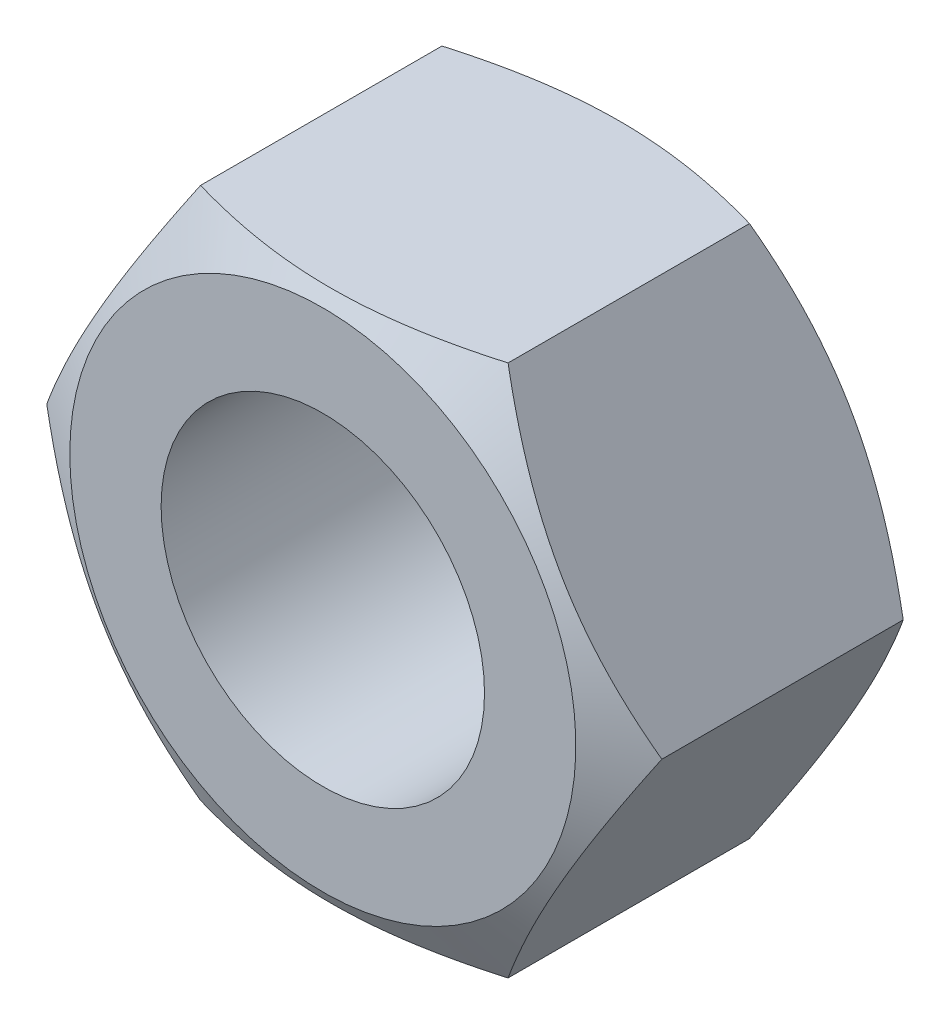
ISO-10303-21;
HEADER;
FILE_DESCRIPTION(('STEP AP214'),'2;1');
FILE_NAME('part.step','',(''),(''),'','','');
FILE_SCHEMA(('AUTOMOTIVE_DESIGN { 1 0 10303 214 1 1 1 1 }'));
ENDSEC;
DATA;
#1=APPLICATION_CONTEXT('core data for automotive mechanical design processes');
#2=APPLICATION_PROTOCOL_DEFINITION('international standard','automotive_design',2000,#1);
#3=PRODUCT_CONTEXT('',#1,'mechanical');
#4=PRODUCT('Part','Part','',(#3));
#5=PRODUCT_RELATED_PRODUCT_CATEGORY('part','',(#4));
#6=PRODUCT_DEFINITION_FORMATION('','',#4);
#7=PRODUCT_DEFINITION_CONTEXT('part definition',#1,'design');
#8=PRODUCT_DEFINITION('design','',#6,#7);
#9=PRODUCT_DEFINITION_SHAPE('','',#8);
#10=(LENGTH_UNIT() NAMED_UNIT(*) SI_UNIT(.MILLI.,.METRE.));
#11=(NAMED_UNIT(*) PLANE_ANGLE_UNIT() SI_UNIT($,.RADIAN.));
#12=(NAMED_UNIT(*) SI_UNIT($,.STERADIAN.) SOLID_ANGLE_UNIT());
#13=UNCERTAINTY_MEASURE_WITH_UNIT(LENGTH_MEASURE(1.E-05),#10,'distance_accuracy_value','');
#14=(GEOMETRIC_REPRESENTATION_CONTEXT(3) GLOBAL_UNCERTAINTY_ASSIGNED_CONTEXT((#13)) GLOBAL_UNIT_ASSIGNED_CONTEXT((#10,
#11,#12)) REPRESENTATION_CONTEXT('',''));
#15=CARTESIAN_POINT('',(0.,0.,0.));
#16=DIRECTION('',(0.,0.,1.));
#17=DIRECTION('',(1.,0.,0.));
#18=AXIS2_PLACEMENT_3D('',#15,#16,#17);
#19=CARTESIAN_POINT('',(8.08290376865476,0.,-8.));
#20=DIRECTION('',(0.866025403784439,0.5,0.));
#21=DIRECTION('',(-0.5,0.866025403784439,0.));
#22=AXIS2_PLACEMENT_3D('',#19,#20,#21);
#23=PLANE('',#22);
#24=CARTESIAN_POINT('',(8.0830192387086,-0.000199999999995565,-0.827354044650867));
#25=CARTESIAN_POINT('',(7.99418356332251,0.153667903293396,-0.776072441269853));
#26=CARTESIAN_POINT('',(7.90501666556988,0.308109500554255,-0.727118188219954));
#27=CARTESIAN_POINT('',(7.72595873929905,0.618246926353258,-0.634505381486502));
#28=CARTESIAN_POINT('',(7.63606741609895,0.773943265295419,-0.590849112295729));
#29=CARTESIAN_POINT('',(7.36495417725225,1.24352516958247,-0.468684186395862));
#30=CARTESIAN_POINT('',(7.18266208641081,1.5592643327378,-0.399198151111319));
#31=CARTESIAN_POINT('',(6.9098652897096,2.03176224476633,-0.317717550615464));
#32=CARTESIAN_POINT('',(6.82017566928259,2.18710922425749,-0.29450607909784));
#33=CARTESIAN_POINT('',(6.64039116946081,2.49850511236217,-0.255583808648828));
#34=CARTESIAN_POINT('',(6.55029632658303,2.65455395772641,-0.239872346995896));
#35=CARTESIAN_POINT('',(6.36995016641051,2.96692267009518,-0.216350507499427));
#36=CARTESIAN_POINT('',(6.27969914366236,3.12324202693001,-0.208531162879232));
#37=CARTESIAN_POINT('',(6.09911871281641,3.43601650800788,-0.200952835988675));
#38=CARTESIAN_POINT('',(6.00878930722636,3.59247162790734,-0.201193604710355));
#39=CARTESIAN_POINT('',(5.76131663355911,4.02110687218394,-0.212932326031969));
#40=CARTESIAN_POINT('',(5.60425437562033,4.2931466828854,-0.232638336959285));
#41=CARTESIAN_POINT('',(5.29117305327855,4.8354194400822,-0.295126054342138));
#42=CARTESIAN_POINT('',(5.13515508991674,5.10565047951828,-0.337929118329354));
#43=CARTESIAN_POINT('',(4.82144370220968,5.64901454193984,-0.44492427392673));
#44=CARTESIAN_POINT('',(4.66378986193159,5.92207900330984,-0.509569688786037));
#45=CARTESIAN_POINT('',(4.35083323311213,6.46413578499063,-0.656288666063407));
#46=CARTESIAN_POINT('',(4.19552643669177,6.73313504715144,-0.738327765241932));
#47=CARTESIAN_POINT('',(4.04133641427354,7.0002,-0.827354044650869));
#48=B_SPLINE_CURVE_WITH_KNOTS('',3,(#24,#25,#26,#27,#28,#29,#30,#31,#32,#33,#34,#35,#36,#37,#38,
#39,#40,#41,#42,#43,#44,#45,#46,#47),.UNSPECIFIED.,.F.,.F.,(4,2,2,2,2,2,2,2,2,2,2,4),(0.,
0.554727910214695,1.10969417576209,2.2219327402719,2.76443041023617,3.30688013473357,
3.8487128486711,4.39052882332379,5.33376515141418,6.27787517570456,7.2429241888324,
8.20607866430097),.UNSPECIFIED.);
#49=CARTESIAN_POINT('',(8.08290376865476,0.,-0.827287376555649));
#50=VERTEX_POINT('',#49);
#51=CARTESIAN_POINT('',(4.04145188432738,7.,-0.827287376555651));
#52=VERTEX_POINT('',#51);
#53=EDGE_CURVE('E55',#50,#52,#48,.T.);
#54=ORIENTED_EDGE('',*,*,#53,.F.);
#55=DIRECTION('',(0.,0.,1.));
#56=VECTOR('',#55,1.);
#57=CARTESIAN_POINT('',(8.08290376865476,0.,-8.));
#58=LINE('',#57,#56);
#59=CARTESIAN_POINT('',(8.08290376865476,0.,-7.17271262344435));
#60=VERTEX_POINT('',#59);
#61=EDGE_CURVE('E12',#60,#50,#58,.T.);
#62=ORIENTED_EDGE('',*,*,#61,.F.);
#63=CARTESIAN_POINT('',(8.0830192387086,-0.000199999999995565,-7.17264595534913));
#64=CARTESIAN_POINT('',(7.99418356332251,0.153667903293396,-7.22392755873015));
#65=CARTESIAN_POINT('',(7.90501666556988,0.308109500554254,-7.27288181178005));
#66=CARTESIAN_POINT('',(7.72595873929905,0.618246926353259,-7.3654946185135));
#67=CARTESIAN_POINT('',(7.63606741609895,0.77394326529542,-7.40915088770427));
#68=CARTESIAN_POINT('',(7.36495417725225,1.24352516958247,-7.53131581360414));
#69=CARTESIAN_POINT('',(7.18266208641081,1.55926433273781,-7.60080184888868));
#70=CARTESIAN_POINT('',(6.9098652897096,2.03176224476633,-7.68228244938454));
#71=CARTESIAN_POINT('',(6.82017566928259,2.18710922425749,-7.70549392090216));
#72=CARTESIAN_POINT('',(6.64039116946081,2.49850511236217,-7.74441619135117));
#73=CARTESIAN_POINT('',(6.55029632658303,2.65455395772641,-7.7601276530041));
#74=CARTESIAN_POINT('',(6.36995016641051,2.96692267009518,-7.78364949250057));
#75=CARTESIAN_POINT('',(6.27969914366237,3.12324202693001,-7.79146883712077));
#76=CARTESIAN_POINT('',(6.09911871281641,3.43601650800788,-7.79904716401133));
#77=CARTESIAN_POINT('',(6.00878930722637,3.59247162790734,-7.79880639528965));
#78=CARTESIAN_POINT('',(5.76131663355911,4.02110687218394,-7.78706767396803));
#79=CARTESIAN_POINT('',(5.60425437562033,4.2931466828854,-7.76736166304071));
#80=CARTESIAN_POINT('',(5.29117305327855,4.8354194400822,-7.70487394565786));
#81=CARTESIAN_POINT('',(5.13515508991674,5.10565047951828,-7.66207088167065));
#82=CARTESIAN_POINT('',(4.82144370220968,5.64901454193984,-7.55507572607327));
#83=CARTESIAN_POINT('',(4.66378986193159,5.92207900330984,-7.49043031121396));
#84=CARTESIAN_POINT('',(4.35083323311213,6.46413578499063,-7.34371133393659));
#85=CARTESIAN_POINT('',(4.19552643669177,6.73313504715144,-7.26167223475807));
#86=CARTESIAN_POINT('',(4.04133641427354,7.0002,-7.17264595534913));
#87=B_SPLINE_CURVE_WITH_KNOTS('',3,(#63,#64,#65,#66,#67,#68,#69,#70,#71,#72,#73,#74,#75,#76,#77,
#78,#79,#80,#81,#82,#83,#84,#85,#86),.UNSPECIFIED.,.F.,.F.,(4,2,2,2,2,2,2,2,2,2,2,4),(0.,
0.554727910214694,1.10969417576209,2.2219327402719,2.76443041023617,3.30688013473357,
3.8487128486711,4.39052882332379,5.33376515141418,6.27787517570456,7.2429241888324,
8.20607866430097),.UNSPECIFIED.);
#88=CARTESIAN_POINT('',(4.04145188432738,7.,-7.17271262344435));
#89=VERTEX_POINT('',#88);
#90=EDGE_CURVE('E124',#60,#89,#87,.T.);
#91=ORIENTED_EDGE('',*,*,#90,.T.);
#92=DIRECTION('',(0.,0.,1.));
#93=VECTOR('',#92,1.);
#94=CARTESIAN_POINT('',(4.04145188432738,7.,-8.));
#95=LINE('',#94,#93);
#96=EDGE_CURVE('E42',#89,#52,#95,.T.);
#97=ORIENTED_EDGE('',*,*,#96,.T.);
#98=EDGE_LOOP('',(#54,#62,#91,#97));
#99=FACE_BOUND('',#98,.T.);
#100=ADVANCED_FACE('F38',(#99),#23,.T.);
#101=CARTESIAN_POINT('',(4.04145188432738,-7.,-8.));
#102=DIRECTION('',(0.866025403784439,-0.5,0.));
#103=DIRECTION('',(0.5,0.866025403784439,0.));
#104=AXIS2_PLACEMENT_3D('',#101,#102,#103);
#105=PLANE('',#104);
#106=CARTESIAN_POINT('',(4.04133641427354,-7.0002,-0.827354044650866));
#107=CARTESIAN_POINT('',(4.13017208965962,-6.8463320967066,-0.776072441269853));
#108=CARTESIAN_POINT('',(4.21933898741226,-6.69189049944575,-0.727118188219953));
#109=CARTESIAN_POINT('',(4.39839691368309,-6.38175307364674,-0.634505381486501));
#110=CARTESIAN_POINT('',(4.48828823688318,-6.22605673470458,-0.590849112295728));
#111=CARTESIAN_POINT('',(4.75940147572989,-5.75647483041753,-0.46868418639586));
#112=CARTESIAN_POINT('',(4.94169356657133,-5.4407356672622,-0.399198151111317));
#113=CARTESIAN_POINT('',(5.21449036327254,-4.96823775523367,-0.317717550615462));
#114=CARTESIAN_POINT('',(5.30417998369955,-4.81289077574251,-0.294506079097839));
#115=CARTESIAN_POINT('',(5.48396448352133,-4.50149488763783,-0.255583808648826));
#116=CARTESIAN_POINT('',(5.57405932639911,-4.34544604227359,-0.239872346995894));
#117=CARTESIAN_POINT('',(5.75440548657163,-4.03307732990482,-0.216350507499425));
#118=CARTESIAN_POINT('',(5.84465650931977,-3.87675797306999,-0.20853116287923));
#119=CARTESIAN_POINT('',(6.02523694016572,-3.56398349199212,-0.200952835988673));
#120=CARTESIAN_POINT('',(6.11556634575577,-3.40752837209266,-0.201193604710352));
#121=CARTESIAN_POINT('',(6.36303901942303,-2.97889312781606,-0.212932326031967));
#122=CARTESIAN_POINT('',(6.52010127736181,-2.7068533171146,-0.232638336959283));
#123=CARTESIAN_POINT('',(6.83318259970358,-2.1645805599178,-0.295126054342136));
#124=CARTESIAN_POINT('',(6.9892005630654,-1.89434952048172,-0.337929118329351));
#125=CARTESIAN_POINT('',(7.30291195077245,-1.35098545806016,-0.444924273926727));
#126=CARTESIAN_POINT('',(7.46056579105054,-1.07792099669016,-0.509569688786034));
#127=CARTESIAN_POINT('',(7.77352241987001,-0.535864215009367,-0.656288666063405));
#128=CARTESIAN_POINT('',(7.92882921629037,-0.266864952848556,-0.738327765241929));
#129=CARTESIAN_POINT('',(8.0830192387086,0.000200000000004987,-0.827354044650866));
#130=B_SPLINE_CURVE_WITH_KNOTS('',3,(#106,#107,#108,#109,#110,#111,#112,#113,#114,#115,#116,
#117,#118,#119,#120,#121,#122,#123,#124,#125,#126,#127,#128,#129),.UNSPECIFIED.,.F.,.F.,(4,2,2,
2,2,2,2,2,2,2,2,4),(0.,0.554727910214695,1.10969417576209,2.2219327402719,2.76443041023617,
3.30688013473357,3.8487128486711,4.39052882332379,5.33376515141418,6.27787517570456,
7.2429241888324,8.20607866430097),.UNSPECIFIED.);
#131=CARTESIAN_POINT('',(4.04145188432738,-7.,-0.827287376555648));
#132=VERTEX_POINT('',#131);
#133=EDGE_CURVE('E191',#132,#50,#130,.T.);
#134=ORIENTED_EDGE('',*,*,#133,.F.);
#135=DIRECTION('',(0.,0.,1.));
#136=VECTOR('',#135,1.);
#137=CARTESIAN_POINT('',(4.04145188432738,-7.,-8.));
#138=LINE('',#137,#136);
#139=CARTESIAN_POINT('',(4.04145188432738,-7.,-7.17271262344435));
#140=VERTEX_POINT('',#139);
#141=EDGE_CURVE('E47',#140,#132,#138,.T.);
#142=ORIENTED_EDGE('',*,*,#141,.F.);
#143=CARTESIAN_POINT('',(4.04133641427354,-7.0002,-7.17264595534913));
#144=CARTESIAN_POINT('',(4.13017208965962,-6.8463320967066,-7.22392755873015));
#145=CARTESIAN_POINT('',(4.21933898741226,-6.69189049944575,-7.27288181178005));
#146=CARTESIAN_POINT('',(4.39839691368309,-6.38175307364674,-7.3654946185135));
#147=CARTESIAN_POINT('',(4.48828823688318,-6.22605673470458,-7.40915088770427));
#148=CARTESIAN_POINT('',(4.75940147572989,-5.75647483041753,-7.53131581360414));
#149=CARTESIAN_POINT('',(4.94169356657133,-5.44073566726219,-7.60080184888868));
#150=CARTESIAN_POINT('',(5.21449036327254,-4.96823775523367,-7.68228244938454));
#151=CARTESIAN_POINT('',(5.30417998369955,-4.81289077574251,-7.70549392090216));
#152=CARTESIAN_POINT('',(5.48396448352133,-4.50149488763783,-7.74441619135117));
#153=CARTESIAN_POINT('',(5.57405932639911,-4.34544604227359,-7.76012765300411));
#154=CARTESIAN_POINT('',(5.75440548657163,-4.03307732990482,-7.78364949250058));
#155=CARTESIAN_POINT('',(5.84465650931977,-3.87675797306999,-7.79146883712077));
#156=CARTESIAN_POINT('',(6.02523694016572,-3.56398349199212,-7.79904716401133));
#157=CARTESIAN_POINT('',(6.11556634575577,-3.40752837209266,-7.79880639528965));
#158=CARTESIAN_POINT('',(6.36303901942303,-2.97889312781606,-7.78706767396803));
#159=CARTESIAN_POINT('',(6.52010127736181,-2.7068533171146,-7.76736166304072));
#160=CARTESIAN_POINT('',(6.83318259970358,-2.1645805599178,-7.70487394565786));
#161=CARTESIAN_POINT('',(6.9892005630654,-1.89434952048172,-7.66207088167065));
#162=CARTESIAN_POINT('',(7.30291195077245,-1.35098545806016,-7.55507572607327));
#163=CARTESIAN_POINT('',(7.46056579105054,-1.07792099669016,-7.49043031121397));
#164=CARTESIAN_POINT('',(7.77352241987001,-0.535864215009367,-7.3437113339366));
#165=CARTESIAN_POINT('',(7.92882921629037,-0.266864952848556,-7.26167223475807));
#166=CARTESIAN_POINT('',(8.0830192387086,0.000200000000004575,-7.17264595534913));
#167=B_SPLINE_CURVE_WITH_KNOTS('',3,(#143,#144,#145,#146,#147,#148,#149,#150,#151,#152,#153,
#154,#155,#156,#157,#158,#159,#160,#161,#162,#163,#164,#165,#166),.UNSPECIFIED.,.F.,.F.,(4,2,2,
2,2,2,2,2,2,2,2,4),(0.,0.554727910214696,1.10969417576209,2.2219327402719,2.76443041023617,
3.30688013473357,3.8487128486711,4.39052882332379,5.33376515141418,6.27787517570456,
7.2429241888324,8.20607866430097),.UNSPECIFIED.);
#168=EDGE_CURVE('E133',#140,#60,#167,.T.);
#169=ORIENTED_EDGE('',*,*,#168,.T.);
#170=ORIENTED_EDGE('',*,*,#61,.T.);
#171=EDGE_LOOP('',(#134,#142,#169,#170));
#172=FACE_BOUND('',#171,.T.);
#173=ADVANCED_FACE('F177',(#172),#105,.T.);
#174=CARTESIAN_POINT('',(4.04145188432738,-7.,-8.));
#175=DIRECTION('',(0.,1.,0.));
#176=DIRECTION('',(-1.,0.,0.));
#177=AXIS2_PLACEMENT_3D('',#174,#175,#176);
#178=PLANE('',#177);
#179=ORIENTED_EDGE('',*,*,#141,.T.);
#180=CARTESIAN_POINT('',(-10.827168769594,-6.99999999999999,-3.60435596322495));
#181=CARTESIAN_POINT('',(-10.5215663969934,-6.99999999999999,-3.45622699880289));
#182=CARTESIAN_POINT('',(-10.2152591795606,-6.99999999999999,-3.30952711799237));
#183=CARTESIAN_POINT('',(-9.60085987994179,-6.99999999999999,-3.01979023915023));
#184=CARTESIAN_POINT('',(-9.29276752264445,-6.99999999999999,-2.8767538251631));
#185=CARTESIAN_POINT('',(-8.6728227986201,-6.99999999999999,-2.59442340614397));
#186=CARTESIAN_POINT('',(-8.36095907597049,-7.,-2.45515424970264));
#187=CARTESIAN_POINT('',(-7.73473988582473,-7.,-2.18235723678039));
#188=CARTESIAN_POINT('',(-7.420384538037,-7.,-2.04882910643238));
#189=CARTESIAN_POINT('',(-6.77886645123334,-7.,-1.78499498645822));
#190=CARTESIAN_POINT('',(-6.45160910338689,-7.,-1.65491776176754));
#191=CARTESIAN_POINT('',(-5.79325666751613,-7.,-1.40467762466172));
#192=CARTESIAN_POINT('',(-5.46216115244183,-7.,-1.28451582778973));
#193=CARTESIAN_POINT('',(-4.79622957052545,-7.,-1.0572807972584));
#194=CARTESIAN_POINT('',(-4.46140270977369,-7.,-0.950180875759514));
#195=CARTESIAN_POINT('',(-3.78695986302793,-7.,-0.752522496810221));
#196=CARTESIAN_POINT('',(-3.44734542953708,-7.,-0.661958804159132));
#197=CARTESIAN_POINT('',(-2.76484412674514,-7.,-0.502194917904565));
#198=CARTESIAN_POINT('',(-2.42198324239951,-7.,-0.432886728977712));
#199=CARTESIAN_POINT('',(-1.90459403666916,-7.,-0.347906447466447));
#200=CARTESIAN_POINT('',(-1.73160237033396,-7.,-0.322742251019017));
#201=CARTESIAN_POINT('',(-1.38476896602443,-7.,-0.279235253216557));
#202=CARTESIAN_POINT('',(-1.21092731168379,-7.,-0.26089179390186));
#203=CARTESIAN_POINT('',(-0.864885948828905,-7.,-0.231620349775585));
#204=CARTESIAN_POINT('',(-0.692694134396466,-7.,-0.220599402078886));
#205=CARTESIAN_POINT('',(-0.34799890841699,-7.,-0.205846971086327));
#206=CARTESIAN_POINT('',(-0.175495502063716,-7.,-0.202115367390177));
#207=CARTESIAN_POINT('',(0.169517895134959,-7.,-0.20203055782241));
#208=CARTESIAN_POINT('',(0.342027886041942,-7.,-0.205677512641572));
#209=CARTESIAN_POINT('',(0.686741670951816,-7.,-0.220261450323908));
#210=CARTESIAN_POINT('',(0.858945449007304,-7.,-0.231198802326856));
#211=CARTESIAN_POINT('',(1.27350328635832,-7.,-0.266074172228107));
#212=CARTESIAN_POINT('',(1.51556921204422,-7.,-0.293509656195727));
#213=CARTESIAN_POINT('',(1.99787569609177,-7.,-0.361284329428631));
#214=CARTESIAN_POINT('',(2.23811600002901,-7.,-0.40162528466239));
#215=CARTESIAN_POINT('',(2.95582448196434,-7.,-0.539864265164558));
#216=CARTESIAN_POINT('',(3.43002349265797,-7.,-0.654953979013658));
#217=CARTESIAN_POINT('',(4.13939008412607,-7.,-0.854251249583947));
#218=CARTESIAN_POINT('',(4.37823837485406,-7.,-0.926107189948117));
#219=CARTESIAN_POINT('',(4.85361261218768,-7.,-1.07719793281492));
#220=CARTESIAN_POINT('',(5.0901385409162,-7.,-1.15643279206995));
#221=CARTESIAN_POINT('',(5.56094952572757,-7.,-1.32101653239824));
#222=CARTESIAN_POINT('',(5.79523527021343,-7.,-1.406363462014));
#223=CARTESIAN_POINT('',(6.26186597233566,-7.,-1.58217518441684));
#224=CARTESIAN_POINT('',(6.49421097685092,-7.,-1.67263985317144));
#225=CARTESIAN_POINT('',(7.13646100232268,-7.,-1.92953333883383));
#226=CARTESIAN_POINT('',(7.54453410007519,-7.,-2.10053819082756));
#227=CARTESIAN_POINT('',(8.35643982797106,-7.,-2.45236939905461));
#228=CARTESIAN_POINT('',(8.76027196486361,-7.,-2.63319688295132));
#229=CARTESIAN_POINT('',(9.56471591541792,-7.,-3.00226226114042));
#230=CARTESIAN_POINT('',(9.96532640618724,-7.,-3.19050302938514));
#231=CARTESIAN_POINT('',(10.7638491532214,-7.,-3.57256098275059));
#232=CARTESIAN_POINT('',(11.1617615242305,-7.,-3.76637792886923));
#233=CARTESIAN_POINT('',(11.9560824970977,-7.,-4.15865269087189));
#234=CARTESIAN_POINT('',(12.3524876588404,-7.,-4.35711745829061));
#235=CARTESIAN_POINT('',(13.1435695953497,-7.,-4.75746525607265));
#236=CARTESIAN_POINT('',(13.5382463547919,-7.,-4.95934831666619));
#237=CARTESIAN_POINT('',(14.3261007155529,-7.,-5.3657985834904));
#238=CARTESIAN_POINT('',(14.719278635656,-7.,-5.57036517251326));
#239=CARTESIAN_POINT('',(15.5044747839954,-7.,-5.98171320922279));
#240=CARTESIAN_POINT('',(15.8964930079928,-7.,-6.18849466499271));
#241=CARTESIAN_POINT('',(16.9853283413492,-7.,-6.76604761862764));
#242=CARTESIAN_POINT('',(17.6811046956104,-7.,-7.1387807495948));
#243=CARTESIAN_POINT('',(19.0704717066478,-7.,-7.88839504928016));
#244=CARTESIAN_POINT('',(19.7640622215154,-7.,-8.2652764804572));
#245=CARTESIAN_POINT('',(21.1472982825406,-7.,-9.02086976752249));
#246=CARTESIAN_POINT('',(21.8369493107226,-7.,-9.39957159688545));
#247=CARTESIAN_POINT('',(23.2148899814658,-7.,-10.1593167073441));
#248=CARTESIAN_POINT('',(23.9031797271619,-7.,-10.5403598013134));
#249=CARTESIAN_POINT('',(24.5909959779398,-7.,-10.9222498339282));
#250=B_SPLINE_CURVE_WITH_KNOTS('',3,(#180,#181,#182,#183,#184,#185,#186,#187,#188,#189,#190,
#191,#192,#193,#194,#195,#196,#197,#198,#199,#200,#201,#202,#203,#204,#205,#206,#207,#208,#209,
#210,#211,#212,#213,#214,#215,#216,#217,#218,#219,#220,#221,#222,#223,#224,#225,#226,#227,#228,
#229,#230,#231,#232,#233,#234,#235,#236,#237,#238,#239,#240,#241,#242,#243,#244,#245,#246,#247,
#248,#249),.UNSPECIFIED.,.F.,.F.,(4,2,2,2,2,2,2,2,2,2,2,2,2,2,2,2,2,2,2,2,2,2,2,2,2,2,2,2,2,2,2,
2,2,2,4),(0.,1.01884281059499,2.03784705067916,3.06244401934184,4.08699205678373,
5.14335076798946,6.19982816409852,7.25410947226173,8.30805642484172,9.35655618973689,
9.8808798833342,10.4051529851274,10.9226360904657,11.4401106483074,11.9575964758687,
12.475108507642,13.2055429046703,13.9360772962082,15.3979163087615,16.1461233575101,
16.8943361613094,17.642311132236,18.3902679831533,19.7174351470128,21.0447549964116,
22.372594581465,23.7003773381643,25.0302919183862,26.3602182660781,27.6898439164845,
29.0194744210803,31.3874289814308,33.7555342310869,36.1158896686156,38.4760588461964),.UNSPECIFIED.);
#251=CARTESIAN_POINT('',(-4.04145188432738,-7.,-0.827287376555648));
#252=VERTEX_POINT('',#251);
#253=EDGE_CURVE('E184',#132,#252,#250,.F.);
#254=ORIENTED_EDGE('',*,*,#253,.T.);
#255=DIRECTION('',(0.,0.,1.));
#256=VECTOR('',#255,1.);
#257=CARTESIAN_POINT('',(-4.04145188432738,-7.,-8.));
#258=LINE('',#257,#256);
#259=CARTESIAN_POINT('',(-4.04145188432738,-7.,-7.17271262344435));
#260=VERTEX_POINT('',#259);
#261=EDGE_CURVE('E113',#260,#252,#258,.T.);
#262=ORIENTED_EDGE('',*,*,#261,.F.);
#263=CARTESIAN_POINT('',(-10.827168769594,-6.99999999999999,-4.39564403677505));
#264=CARTESIAN_POINT('',(-10.5215663969934,-6.99999999999999,-4.54377300119711));
#265=CARTESIAN_POINT('',(-10.2152591795606,-6.99999999999999,-4.69047288200763));
#266=CARTESIAN_POINT('',(-9.60085987994179,-6.99999999999999,-4.98020976084977));
#267=CARTESIAN_POINT('',(-9.29276752264445,-6.99999999999999,-5.1232461748369));
#268=CARTESIAN_POINT('',(-8.6728227986201,-6.99999999999999,-5.40557659385603));
#269=CARTESIAN_POINT('',(-8.36095907597049,-7.,-5.54484575029736));
#270=CARTESIAN_POINT('',(-7.73473988582473,-7.,-5.81764276321961));
#271=CARTESIAN_POINT('',(-7.420384538037,-7.,-5.95117089356762));
#272=CARTESIAN_POINT('',(-6.77886645123334,-7.,-6.21500501354178));
#273=CARTESIAN_POINT('',(-6.45160910338689,-7.,-6.34508223823246));
#274=CARTESIAN_POINT('',(-5.79325666751613,-7.,-6.59532237533828));
#275=CARTESIAN_POINT('',(-5.46216115244183,-7.,-6.71548417221027));
#276=CARTESIAN_POINT('',(-4.79622957052545,-7.,-6.9427192027416));
#277=CARTESIAN_POINT('',(-4.46140270977369,-7.,-7.04981912424049));
#278=CARTESIAN_POINT('',(-3.78695986302793,-7.,-7.24747750318978));
#279=CARTESIAN_POINT('',(-3.44734542953708,-7.,-7.33804119584087));
#280=CARTESIAN_POINT('',(-2.76484412674514,-7.,-7.49780508209543));
#281=CARTESIAN_POINT('',(-2.42198324239951,-7.,-7.56711327102229));
#282=CARTESIAN_POINT('',(-1.90459403666916,-7.,-7.65209355253355));
#283=CARTESIAN_POINT('',(-1.73160237033396,-7.,-7.67725774898098));
#284=CARTESIAN_POINT('',(-1.38476896602443,-7.,-7.72076474678344));
#285=CARTESIAN_POINT('',(-1.21092731168379,-7.,-7.73910820609814));
#286=CARTESIAN_POINT('',(-0.864885948828905,-7.,-7.76837965022442));
#287=CARTESIAN_POINT('',(-0.692694134396466,-7.,-7.77940059792111));
#288=CARTESIAN_POINT('',(-0.34799890841699,-7.,-7.79415302891367));
#289=CARTESIAN_POINT('',(-0.175495502063716,-7.,-7.79788463260982));
#290=CARTESIAN_POINT('',(0.169517895134959,-7.,-7.79796944217759));
#291=CARTESIAN_POINT('',(0.342027886041942,-7.,-7.79432248735843));
#292=CARTESIAN_POINT('',(0.686741670951816,-7.,-7.77973854967609));
#293=CARTESIAN_POINT('',(0.858945449007304,-7.,-7.76880119767314));
#294=CARTESIAN_POINT('',(1.27350328635832,-7.,-7.73392582777189));
#295=CARTESIAN_POINT('',(1.51556921204422,-7.,-7.70649034380427));
#296=CARTESIAN_POINT('',(1.99787569609177,-7.,-7.63871567057137));
#297=CARTESIAN_POINT('',(2.23811600002901,-7.,-7.59837471533761));
#298=CARTESIAN_POINT('',(2.95582448196434,-7.,-7.46013573483544));
#299=CARTESIAN_POINT('',(3.43002349265797,-7.,-7.34504602098634));
#300=CARTESIAN_POINT('',(4.13939008412607,-7.,-7.14574875041605));
#301=CARTESIAN_POINT('',(4.37823837485406,-7.,-7.07389281005188));
#302=CARTESIAN_POINT('',(4.85361261218768,-7.,-6.92280206718508));
#303=CARTESIAN_POINT('',(5.0901385409162,-7.,-6.84356720793005));
#304=CARTESIAN_POINT('',(5.56094952572757,-7.,-6.67898346760176));
#305=CARTESIAN_POINT('',(5.79523527021344,-7.,-6.593636537986));
#306=CARTESIAN_POINT('',(6.26186597233566,-7.,-6.41782481558315));
#307=CARTESIAN_POINT('',(6.49421097685092,-7.,-6.32736014682856));
#308=CARTESIAN_POINT('',(7.13646100232268,-7.,-6.07046666116617));
#309=CARTESIAN_POINT('',(7.5445341000752,-7.,-5.89946180917244));
#310=CARTESIAN_POINT('',(8.35643982797106,-7.,-5.54763060094538));
#311=CARTESIAN_POINT('',(8.76027196486361,-7.,-5.36680311704868));
#312=CARTESIAN_POINT('',(9.56471591541792,-7.,-4.99773773885958));
#313=CARTESIAN_POINT('',(9.96532640618724,-7.,-4.80949697061486));
#314=CARTESIAN_POINT('',(10.7638491532214,-7.,-4.42743901724941));
#315=CARTESIAN_POINT('',(11.1617615242305,-7.,-4.23362207113077));
#316=CARTESIAN_POINT('',(11.9560824970977,-7.,-3.84134730912811));
#317=CARTESIAN_POINT('',(12.3524876588404,-7.,-3.64288254170938));
#318=CARTESIAN_POINT('',(13.1435695953497,-7.,-3.24253474392736));
#319=CARTESIAN_POINT('',(13.5382463547919,-7.,-3.04065168333381));
#320=CARTESIAN_POINT('',(14.3261007155529,-7.,-2.6342014165096));
#321=CARTESIAN_POINT('',(14.719278635656,-7.,-2.42963482748674));
#322=CARTESIAN_POINT('',(15.5044747839954,-7.,-2.01828679077721));
#323=CARTESIAN_POINT('',(15.8964930079928,-7.,-1.81150533500729));
#324=CARTESIAN_POINT('',(16.9853283413492,-7.,-1.23395238137236));
#325=CARTESIAN_POINT('',(17.6811046956104,-7.,-0.861219250405194));
#326=CARTESIAN_POINT('',(19.0704717066478,-7.,-0.111604950719839));
#327=CARTESIAN_POINT('',(19.7640622215154,-7.,0.265276480457202));
#328=CARTESIAN_POINT('',(21.1472982825406,-7.,1.02086976752249));
#329=CARTESIAN_POINT('',(21.8369493107226,-7.,1.39957159688545));
#330=CARTESIAN_POINT('',(23.2148899814658,-7.,2.1593167073441));
#331=CARTESIAN_POINT('',(23.9031797271619,-7.,2.54035980131337));
#332=CARTESIAN_POINT('',(24.5909959779398,-7.,2.92224983392818));
#333=B_SPLINE_CURVE_WITH_KNOTS('',3,(#263,#264,#265,#266,#267,#268,#269,#270,#271,#272,#273,
#274,#275,#276,#277,#278,#279,#280,#281,#282,#283,#284,#285,#286,#287,#288,#289,#290,#291,#292,
#293,#294,#295,#296,#297,#298,#299,#300,#301,#302,#303,#304,#305,#306,#307,#308,#309,#310,#311,
#312,#313,#314,#315,#316,#317,#318,#319,#320,#321,#322,#323,#324,#325,#326,#327,#328,#329,#330,
#331,#332),.UNSPECIFIED.,.F.,.F.,(4,2,2,2,2,2,2,2,2,2,2,2,2,2,2,2,2,2,2,2,2,2,2,2,2,2,2,2,2,2,2,
2,2,2,4),(0.,1.01884281059499,2.03784705067916,3.06244401934184,4.08699205678373,
5.14335076798946,6.19982816409852,7.25410947226173,8.30805642484172,9.35655618973689,
9.8808798833342,10.4051529851274,10.9226360904657,11.4401106483074,11.9575964758687,
12.475108507642,13.2055429046703,13.9360772962082,15.3979163087615,16.1461233575102,
16.8943361613094,17.642311132236,18.3902679831533,19.7174351470128,21.0447549964116,
22.372594581465,23.7003773381643,25.0302919183862,26.3602182660781,27.6898439164845,
29.0194744210803,31.3874289814308,33.7555342310869,36.1158896686156,38.4760588461964),.UNSPECIFIED.);
#334=EDGE_CURVE('E168',#140,#260,#333,.F.);
#335=ORIENTED_EDGE('',*,*,#334,.F.);
#336=EDGE_LOOP('',(#179,#254,#262,#335));
#337=FACE_BOUND('',#336,.T.);
#338=ADVANCED_FACE('F173',(#337),#178,.F.);
#339=CARTESIAN_POINT('',(-8.08290376865476,0.,-8.));
#340=DIRECTION('',(-0.866025403784439,-0.5,0.));
#341=DIRECTION('',(0.5,-0.866025403784439,0.));
#342=AXIS2_PLACEMENT_3D('',#339,#340,#341);
#343=PLANE('',#342);
#344=CARTESIAN_POINT('',(-8.0830192387086,0.000200000000004512,-0.827354044650867));
#345=CARTESIAN_POINT('',(-7.99418356332251,-0.153667903293387,-0.776072441269853));
#346=CARTESIAN_POINT('',(-7.90501666556988,-0.308109500554245,-0.727118188219953));
#347=CARTESIAN_POINT('',(-7.72595873929905,-0.618246926353249,-0.634505381486501));
#348=CARTESIAN_POINT('',(-7.63606741609895,-0.77394326529541,-0.590849112295729));
#349=CARTESIAN_POINT('',(-7.36495417725225,-1.24352516958246,-0.468684186395862));
#350=CARTESIAN_POINT('',(-7.18266208641081,-1.5592643327378,-0.399198151111318));
#351=CARTESIAN_POINT('',(-6.9098652897096,-2.03176224476633,-0.317717550615462));
#352=CARTESIAN_POINT('',(-6.82017566928259,-2.18710922425748,-0.294506079097839));
#353=CARTESIAN_POINT('',(-6.64039116946081,-2.49850511236216,-0.255583808648826));
#354=CARTESIAN_POINT('',(-6.55029632658303,-2.6545539577264,-0.239872346995894));
#355=CARTESIAN_POINT('',(-6.36995016641051,-2.96692267009517,-0.216350507499425));
#356=CARTESIAN_POINT('',(-6.27969914366237,-3.12324202693,-0.20853116287923));
#357=CARTESIAN_POINT('',(-6.09911871281641,-3.43601650800787,-0.200952835988672));
#358=CARTESIAN_POINT('',(-6.00878930722637,-3.59247162790733,-0.201193604710352));
#359=CARTESIAN_POINT('',(-5.76131663355911,-4.02110687218393,-0.212932326031967));
#360=CARTESIAN_POINT('',(-5.60425437562033,-4.29314668288539,-0.232638336959283));
#361=CARTESIAN_POINT('',(-5.29117305327855,-4.83541944008219,-0.295126054342136));
#362=CARTESIAN_POINT('',(-5.13515508991674,-5.10565047951828,-0.337929118329351));
#363=CARTESIAN_POINT('',(-4.82144370220969,-5.64901454193983,-0.444924273926726));
#364=CARTESIAN_POINT('',(-4.66378986193159,-5.92207900330984,-0.509569688786034));
#365=CARTESIAN_POINT('',(-4.35083323311213,-6.46413578499063,-0.656288666063404));
#366=CARTESIAN_POINT('',(-4.19552643669177,-6.73313504715144,-0.738327765241929));
#367=CARTESIAN_POINT('',(-4.04133641427354,-7.0002,-0.827354044650866));
#368=B_SPLINE_CURVE_WITH_KNOTS('',3,(#344,#345,#346,#347,#348,#349,#350,#351,#352,#353,#354,
#355,#356,#357,#358,#359,#360,#361,#362,#363,#364,#365,#366,#367),.UNSPECIFIED.,.F.,.F.,(4,2,2,
2,2,2,2,2,2,2,2,4),(0.,0.554727910214693,1.10969417576209,2.2219327402719,2.76443041023617,
3.30688013473357,3.8487128486711,4.39052882332379,5.33376515141418,6.27787517570456,
7.2429241888324,8.20607866430097),.UNSPECIFIED.);
#369=CARTESIAN_POINT('',(-8.08290376865476,0.,-0.82728737655565));
#370=VERTEX_POINT('',#369);
#371=EDGE_CURVE('E109',#370,#252,#368,.T.);
#372=ORIENTED_EDGE('',*,*,#371,.F.);
#373=DIRECTION('',(0.,0.,1.));
#374=VECTOR('',#373,1.);
#375=CARTESIAN_POINT('',(-8.08290376865476,0.,-8.));
#376=LINE('',#375,#374);
#377=CARTESIAN_POINT('',(-8.08290376865476,0.,-7.17271262344435));
#378=VERTEX_POINT('',#377);
#379=EDGE_CURVE('E108',#378,#370,#376,.T.);
#380=ORIENTED_EDGE('',*,*,#379,.F.);
#381=CARTESIAN_POINT('',(-8.0830192387086,0.000200000000004512,-7.17264595534913));
#382=CARTESIAN_POINT('',(-7.99418356332251,-0.153667903293387,-7.22392755873015));
#383=CARTESIAN_POINT('',(-7.90501666556988,-0.308109500554245,-7.27288181178005));
#384=CARTESIAN_POINT('',(-7.72595873929905,-0.618246926353249,-7.3654946185135));
#385=CARTESIAN_POINT('',(-7.63606741609895,-0.77394326529541,-7.40915088770427));
#386=CARTESIAN_POINT('',(-7.36495417725225,-1.24352516958246,-7.53131581360414));
#387=CARTESIAN_POINT('',(-7.18266208641081,-1.5592643327378,-7.60080184888868));
#388=CARTESIAN_POINT('',(-6.9098652897096,-2.03176224476633,-7.68228244938454));
#389=CARTESIAN_POINT('',(-6.82017566928259,-2.18710922425748,-7.70549392090216));
#390=CARTESIAN_POINT('',(-6.64039116946081,-2.49850511236216,-7.74441619135117));
#391=CARTESIAN_POINT('',(-6.55029632658303,-2.6545539577264,-7.7601276530041));
#392=CARTESIAN_POINT('',(-6.36995016641051,-2.96692267009517,-7.78364949250058));
#393=CARTESIAN_POINT('',(-6.27969914366237,-3.12324202693,-7.79146883712077));
#394=CARTESIAN_POINT('',(-6.09911871281641,-3.43601650800787,-7.79904716401133));
#395=CARTESIAN_POINT('',(-6.00878930722637,-3.59247162790733,-7.79880639528965));
#396=CARTESIAN_POINT('',(-5.76131663355911,-4.02110687218393,-7.78706767396803));
#397=CARTESIAN_POINT('',(-5.60425437562033,-4.29314668288539,-7.76736166304072));
#398=CARTESIAN_POINT('',(-5.29117305327855,-4.83541944008219,-7.70487394565786));
#399=CARTESIAN_POINT('',(-5.13515508991674,-5.10565047951828,-7.66207088167065));
#400=CARTESIAN_POINT('',(-4.82144370220969,-5.64901454193983,-7.55507572607327));
#401=CARTESIAN_POINT('',(-4.66378986193159,-5.92207900330984,-7.49043031121397));
#402=CARTESIAN_POINT('',(-4.35083323311213,-6.46413578499063,-7.3437113339366));
#403=CARTESIAN_POINT('',(-4.19552643669177,-6.73313504715144,-7.26167223475807));
#404=CARTESIAN_POINT('',(-4.04133641427354,-7.0002,-7.17264595534913));
#405=B_SPLINE_CURVE_WITH_KNOTS('',3,(#381,#382,#383,#384,#385,#386,#387,#388,#389,#390,#391,
#392,#393,#394,#395,#396,#397,#398,#399,#400,#401,#402,#403,#404),.UNSPECIFIED.,.F.,.F.,(4,2,2,
2,2,2,2,2,2,2,2,4),(0.,0.554727910214693,1.10969417576209,2.2219327402719,2.76443041023617,
3.30688013473357,3.8487128486711,4.39052882332379,5.33376515141418,6.27787517570456,
7.2429241888324,8.20607866430097),.UNSPECIFIED.);
#406=EDGE_CURVE('E163',#378,#260,#405,.T.);
#407=ORIENTED_EDGE('',*,*,#406,.T.);
#408=ORIENTED_EDGE('',*,*,#261,.T.);
#409=EDGE_LOOP('',(#372,#380,#407,#408));
#410=FACE_BOUND('',#409,.T.);
#411=ADVANCED_FACE('F176',(#410),#343,.T.);
#412=CARTESIAN_POINT('',(-4.04145188432738,7.,-8.));
#413=DIRECTION('',(-0.866025403784439,0.5,0.));
#414=DIRECTION('',(-0.5,-0.866025403784439,0.));
#415=AXIS2_PLACEMENT_3D('',#412,#413,#414);
#416=PLANE('',#415);
#417=CARTESIAN_POINT('',(-4.04133641427354,7.0002,-0.827354044650869));
#418=CARTESIAN_POINT('',(-4.13017208965962,6.84633209670661,-0.776072441269855));
#419=CARTESIAN_POINT('',(-4.21933898741226,6.69189049944575,-0.727118188219956));
#420=CARTESIAN_POINT('',(-4.39839691368309,6.38175307364675,-0.634505381486504));
#421=CARTESIAN_POINT('',(-4.48828823688318,6.22605673470459,-0.59084911229573));
#422=CARTESIAN_POINT('',(-4.75940147572989,5.75647483041754,-0.468684186395863));
#423=CARTESIAN_POINT('',(-4.94169356657133,5.4407356672622,-0.399198151111319));
#424=CARTESIAN_POINT('',(-5.21449036327254,4.96823775523367,-0.317717550615465));
#425=CARTESIAN_POINT('',(-5.30417998369955,4.81289077574252,-0.294506079097841));
#426=CARTESIAN_POINT('',(-5.48396448352133,4.50149488763784,-0.255583808648829));
#427=CARTESIAN_POINT('',(-5.57405932639911,4.34544604227359,-0.239872346995897));
#428=CARTESIAN_POINT('',(-5.75440548657163,4.03307732990483,-0.216350507499428));
#429=CARTESIAN_POINT('',(-5.84465650931977,3.87675797306999,-0.208531162879232));
#430=CARTESIAN_POINT('',(-6.02523694016572,3.56398349199213,-0.200952835988675));
#431=CARTESIAN_POINT('',(-6.11556634575577,3.40752837209266,-0.201193604710355));
#432=CARTESIAN_POINT('',(-6.36303901942303,2.97889312781607,-0.212932326031969));
#433=CARTESIAN_POINT('',(-6.52010127736181,2.7068533171146,-0.232638336959285));
#434=CARTESIAN_POINT('',(-6.83318259970358,2.16458055991781,-0.295126054342138));
#435=CARTESIAN_POINT('',(-6.9892005630654,1.89434952048172,-0.337929118329353));
#436=CARTESIAN_POINT('',(-7.30291195077245,1.35098545806017,-0.444924273926729));
#437=CARTESIAN_POINT('',(-7.46056579105055,1.07792099669016,-0.509569688786036));
#438=CARTESIAN_POINT('',(-7.77352241987001,0.535864215009375,-0.656288666063405));
#439=CARTESIAN_POINT('',(-7.92882921629037,0.266864952848564,-0.73832776524193));
#440=CARTESIAN_POINT('',(-8.0830192387086,-0.000199999999995913,-0.827354044650867));
#441=B_SPLINE_CURVE_WITH_KNOTS('',3,(#417,#418,#419,#420,#421,#422,#423,#424,#425,#426,#427,
#428,#429,#430,#431,#432,#433,#434,#435,#436,#437,#438,#439,#440),.UNSPECIFIED.,.F.,.F.,(4,2,2,
2,2,2,2,2,2,2,2,4),(0.,0.554727910214694,1.10969417576209,2.2219327402719,2.76443041023617,
3.30688013473357,3.8487128486711,4.39052882332379,5.33376515141419,6.27787517570456,
7.2429241888324,8.20607866430097),.UNSPECIFIED.);
#442=CARTESIAN_POINT('',(-4.04145188432738,7.,-0.827287376555651));
#443=VERTEX_POINT('',#442);
#444=EDGE_CURVE('E94',#443,#370,#441,.T.);
#445=ORIENTED_EDGE('',*,*,#444,.F.);
#446=DIRECTION('',(0.,0.,1.));
#447=VECTOR('',#446,1.);
#448=CARTESIAN_POINT('',(-4.04145188432738,7.,-8.));
#449=LINE('',#448,#447);
#450=CARTESIAN_POINT('',(-4.04145188432738,7.,-7.17271262344435));
#451=VERTEX_POINT('',#450);
#452=EDGE_CURVE('E106',#451,#443,#449,.T.);
#453=ORIENTED_EDGE('',*,*,#452,.F.);
#454=CARTESIAN_POINT('',(-4.04133641427354,7.0002,-7.17264595534913));
#455=CARTESIAN_POINT('',(-4.13017208965962,6.84633209670661,-7.22392755873015));
#456=CARTESIAN_POINT('',(-4.21933898741226,6.69189049944575,-7.27288181178004));
#457=CARTESIAN_POINT('',(-4.39839691368309,6.38175307364675,-7.3654946185135));
#458=CARTESIAN_POINT('',(-4.48828823688318,6.22605673470459,-7.40915088770427));
#459=CARTESIAN_POINT('',(-4.75940147572989,5.75647483041754,-7.53131581360414));
#460=CARTESIAN_POINT('',(-4.94169356657133,5.4407356672622,-7.60080184888868));
#461=CARTESIAN_POINT('',(-5.21449036327254,4.96823775523367,-7.68228244938454));
#462=CARTESIAN_POINT('',(-5.30417998369955,4.81289077574252,-7.70549392090216));
#463=CARTESIAN_POINT('',(-5.48396448352133,4.50149488763784,-7.74441619135117));
#464=CARTESIAN_POINT('',(-5.57405932639911,4.34544604227359,-7.7601276530041));
#465=CARTESIAN_POINT('',(-5.75440548657163,4.03307732990483,-7.78364949250057));
#466=CARTESIAN_POINT('',(-5.84465650931977,3.87675797306999,-7.79146883712077));
#467=CARTESIAN_POINT('',(-6.02523694016572,3.56398349199213,-7.79904716401133));
#468=CARTESIAN_POINT('',(-6.11556634575577,3.40752837209266,-7.79880639528964));
#469=CARTESIAN_POINT('',(-6.36303901942303,2.97889312781607,-7.78706767396803));
#470=CARTESIAN_POINT('',(-6.52010127736181,2.7068533171146,-7.76736166304072));
#471=CARTESIAN_POINT('',(-6.83318259970358,2.16458055991781,-7.70487394565786));
#472=CARTESIAN_POINT('',(-6.9892005630654,1.89434952048172,-7.66207088167065));
#473=CARTESIAN_POINT('',(-7.30291195077245,1.35098545806017,-7.55507572607327));
#474=CARTESIAN_POINT('',(-7.46056579105055,1.07792099669016,-7.49043031121396));
#475=CARTESIAN_POINT('',(-7.77352241987001,0.535864215009376,-7.34371133393659));
#476=CARTESIAN_POINT('',(-7.92882921629037,0.266864952848565,-7.26167223475807));
#477=CARTESIAN_POINT('',(-8.0830192387086,-0.000199999999995708,-7.17264595534913));
#478=B_SPLINE_CURVE_WITH_KNOTS('',3,(#454,#455,#456,#457,#458,#459,#460,#461,#462,#463,#464,
#465,#466,#467,#468,#469,#470,#471,#472,#473,#474,#475,#476,#477),.UNSPECIFIED.,.F.,.F.,(4,2,2,
2,2,2,2,2,2,2,2,4),(0.,0.554727910214693,1.10969417576209,2.2219327402719,2.76443041023617,
3.30688013473357,3.8487128486711,4.39052882332379,5.33376515141419,6.27787517570456,
7.2429241888324,8.20607866430097),.UNSPECIFIED.);
#479=EDGE_CURVE('E63',#451,#378,#478,.T.);
#480=ORIENTED_EDGE('',*,*,#479,.T.);
#481=ORIENTED_EDGE('',*,*,#379,.T.);
#482=EDGE_LOOP('',(#445,#453,#480,#481));
#483=FACE_BOUND('',#482,.T.);
#484=ADVANCED_FACE('F105',(#483),#416,.T.);
#485=CARTESIAN_POINT('',(4.04145188432738,7.,-8.));
#486=DIRECTION('',(0.,1.,0.));
#487=DIRECTION('',(-1.,0.,0.));
#488=AXIS2_PLACEMENT_3D('',#485,#486,#487);
#489=PLANE('',#488);
#490=CARTESIAN_POINT('',(-10.827168769594,7.,-3.60435596322495));
#491=CARTESIAN_POINT('',(-10.5215663969934,7.,-3.4562269988029));
#492=CARTESIAN_POINT('',(-10.2152591795606,7.,-3.30952711799237));
#493=CARTESIAN_POINT('',(-9.6008598799418,7.,-3.01979023915024));
#494=CARTESIAN_POINT('',(-9.29276752264446,7.,-2.8767538251631));
#495=CARTESIAN_POINT('',(-8.67282279862011,7.,-2.59442340614398));
#496=CARTESIAN_POINT('',(-8.36095907597049,7.,-2.45515424970265));
#497=CARTESIAN_POINT('',(-7.73473988582473,7.,-2.18235723678039));
#498=CARTESIAN_POINT('',(-7.42038453803701,7.,-2.04882910643238));
#499=CARTESIAN_POINT('',(-6.77886645123334,7.,-1.78499498645822));
#500=CARTESIAN_POINT('',(-6.45160910338689,7.,-1.65491776176754));
#501=CARTESIAN_POINT('',(-5.79325666751613,7.,-1.40467762466172));
#502=CARTESIAN_POINT('',(-5.46216115244183,7.,-1.28451582778973));
#503=CARTESIAN_POINT('',(-4.79622957052545,7.,-1.0572807972584));
#504=CARTESIAN_POINT('',(-4.46140270977369,7.,-0.950180875759518));
#505=CARTESIAN_POINT('',(-3.78695986302793,7.,-0.752522496810224));
#506=CARTESIAN_POINT('',(-3.44734542953708,7.,-0.661958804159135));
#507=CARTESIAN_POINT('',(-2.76484412674514,7.,-0.502194917904568));
#508=CARTESIAN_POINT('',(-2.42198324239951,7.,-0.432886728977715));
#509=CARTESIAN_POINT('',(-1.90459403666916,7.,-0.34790644746645));
#510=CARTESIAN_POINT('',(-1.73160237033396,7.,-0.32274225101902));
#511=CARTESIAN_POINT('',(-1.38476896602443,7.,-0.27923525321656));
#512=CARTESIAN_POINT('',(-1.21092731168379,7.,-0.260891793901863));
#513=CARTESIAN_POINT('',(-0.864885948828904,7.,-0.231620349775588));
#514=CARTESIAN_POINT('',(-0.692694134396466,7.,-0.220599402078889));
#515=CARTESIAN_POINT('',(-0.347998908416989,7.,-0.205846971086331));
#516=CARTESIAN_POINT('',(-0.175495502063716,7.,-0.202115367390181));
#517=CARTESIAN_POINT('',(0.16951789513496,7.,-0.202030557822413));
#518=CARTESIAN_POINT('',(0.342027886041944,7.,-0.205677512641575));
#519=CARTESIAN_POINT('',(0.686741670951819,7.,-0.220261450323912));
#520=CARTESIAN_POINT('',(0.858945449007307,7.,-0.23119880232686));
#521=CARTESIAN_POINT('',(1.27350328635833,7.,-0.266074172228111));
#522=CARTESIAN_POINT('',(1.51556921204423,7.,-0.293509656195731));
#523=CARTESIAN_POINT('',(1.99787569609178,7.,-0.361284329428635));
#524=CARTESIAN_POINT('',(2.23811600002902,7.,-0.401625284662394));
#525=CARTESIAN_POINT('',(2.95582448196435,7.,-0.539864265164563));
#526=CARTESIAN_POINT('',(3.43002349265797,7.,-0.654953979013663));
#527=CARTESIAN_POINT('',(4.13939008412608,7.,-0.854251249583953));
#528=CARTESIAN_POINT('',(4.37823837485407,7.,-0.926107189948123));
#529=CARTESIAN_POINT('',(4.85361261218769,7.,-1.07719793281492));
#530=CARTESIAN_POINT('',(5.09013854091621,7.,-1.15643279206995));
#531=CARTESIAN_POINT('',(5.56094952572758,7.,-1.32101653239824));
#532=CARTESIAN_POINT('',(5.79523527021344,7.,-1.40636346201401));
#533=CARTESIAN_POINT('',(6.26186597233567,7.,-1.58217518441685));
#534=CARTESIAN_POINT('',(6.49421097685093,7.,-1.67263985317145));
#535=CARTESIAN_POINT('',(7.13646100232269,7.,-1.92953333883384));
#536=CARTESIAN_POINT('',(7.5445341000752,7.,-2.10053819082757));
#537=CARTESIAN_POINT('',(8.35643982797107,7.,-2.45236939905462));
#538=CARTESIAN_POINT('',(8.76027196486362,7.,-2.63319688295133));
#539=CARTESIAN_POINT('',(9.56471591541793,7.,-3.00226226114042));
#540=CARTESIAN_POINT('',(9.96532640618725,7.,-3.19050302938515));
#541=CARTESIAN_POINT('',(10.7638491532214,7.,-3.5725609827506));
#542=CARTESIAN_POINT('',(11.1617615242305,7.,-3.76637792886924));
#543=CARTESIAN_POINT('',(11.9560824970977,7.,-4.1586526908719));
#544=CARTESIAN_POINT('',(12.3524876588404,7.,-4.35711745829062));
#545=CARTESIAN_POINT('',(13.1435695953497,7.,-4.75746525607265));
#546=CARTESIAN_POINT('',(13.5382463547919,7.,-4.9593483166662));
#547=CARTESIAN_POINT('',(14.3261007155529,7.,-5.3657985834904));
#548=CARTESIAN_POINT('',(14.719278635656,7.,-5.57036517251327));
#549=CARTESIAN_POINT('',(15.5044747839955,7.,-5.98171320922279));
#550=CARTESIAN_POINT('',(15.8964930079928,7.,-6.18849466499272));
#551=CARTESIAN_POINT('',(16.9853283413492,7.,-6.76604761862764));
#552=CARTESIAN_POINT('',(17.6811046956104,7.,-7.13878074959481));
#553=CARTESIAN_POINT('',(19.0704717066479,7.,-7.88839504928016));
#554=CARTESIAN_POINT('',(19.7640622215154,7.,-8.2652764804572));
#555=CARTESIAN_POINT('',(21.1472982825406,7.,-9.02086976752249));
#556=CARTESIAN_POINT('',(21.8369493107226,7.,-9.39957159688545));
#557=CARTESIAN_POINT('',(23.2148899814658,7.,-10.1593167073441));
#558=CARTESIAN_POINT('',(23.9031797271619,7.,-10.5403598013134));
#559=CARTESIAN_POINT('',(24.5909959779398,7.00000000000001,-10.9222498339282));
#560=B_SPLINE_CURVE_WITH_KNOTS('',3,(#490,#491,#492,#493,#494,#495,#496,#497,#498,#499,#500,
#501,#502,#503,#504,#505,#506,#507,#508,#509,#510,#511,#512,#513,#514,#515,#516,#517,#518,#519,
#520,#521,#522,#523,#524,#525,#526,#527,#528,#529,#530,#531,#532,#533,#534,#535,#536,#537,#538,
#539,#540,#541,#542,#543,#544,#545,#546,#547,#548,#549,#550,#551,#552,#553,#554,#555,#556,#557,
#558,#559),.UNSPECIFIED.,.F.,.F.,(4,2,2,2,2,2,2,2,2,2,2,2,2,2,2,2,2,2,2,2,2,2,2,2,2,2,2,2,2,2,2,
2,2,2,4),(0.,1.01884281059499,2.03784705067916,3.06244401934184,4.08699205678373,
5.14335076798946,6.19982816409852,7.25410947226174,8.30805642484173,9.35655618973689,
9.88087988333421,10.4051529851274,10.9226360904657,11.4401106483074,11.9575964758687,
12.475108507642,13.2055429046703,13.9360772962082,15.3979163087615,16.1461233575102,
16.8943361613094,17.6423111322361,18.3902679831533,19.7174351470128,21.0447549964116,
22.372594581465,23.7003773381643,25.0302919183863,26.3602182660781,27.6898439164845,
29.0194744210804,31.3874289814308,33.7555342310869,36.1158896686156,38.4760588461964),.UNSPECIFIED.);
#561=EDGE_CURVE('E90',#52,#443,#560,.F.);
#562=ORIENTED_EDGE('',*,*,#561,.F.);
#563=ORIENTED_EDGE('',*,*,#96,.F.);
#564=CARTESIAN_POINT('',(-10.827168769594,7.,-4.39564403677505));
#565=CARTESIAN_POINT('',(-10.5215663969934,7.,-4.5437730011971));
#566=CARTESIAN_POINT('',(-10.2152591795606,7.,-4.69047288200762));
#567=CARTESIAN_POINT('',(-9.6008598799418,7.,-4.98020976084976));
#568=CARTESIAN_POINT('',(-9.29276752264446,7.,-5.1232461748369));
#569=CARTESIAN_POINT('',(-8.67282279862011,7.,-5.40557659385602));
#570=CARTESIAN_POINT('',(-8.36095907597049,7.,-5.54484575029735));
#571=CARTESIAN_POINT('',(-7.73473988582473,7.,-5.81764276321961));
#572=CARTESIAN_POINT('',(-7.42038453803701,7.,-5.95117089356762));
#573=CARTESIAN_POINT('',(-6.77886645123334,7.,-6.21500501354178));
#574=CARTESIAN_POINT('',(-6.45160910338689,7.,-6.34508223823246));
#575=CARTESIAN_POINT('',(-5.79325666751613,7.,-6.59532237533828));
#576=CARTESIAN_POINT('',(-5.46216115244183,7.,-6.71548417221027));
#577=CARTESIAN_POINT('',(-4.79622957052545,7.,-6.9427192027416));
#578=CARTESIAN_POINT('',(-4.46140270977369,7.,-7.04981912424048));
#579=CARTESIAN_POINT('',(-3.78695986302793,7.,-7.24747750318978));
#580=CARTESIAN_POINT('',(-3.44734542953708,7.,-7.33804119584086));
#581=CARTESIAN_POINT('',(-2.76484412674514,7.,-7.49780508209543));
#582=CARTESIAN_POINT('',(-2.42198324239951,7.,-7.56711327102228));
#583=CARTESIAN_POINT('',(-1.90459403666916,7.,-7.65209355253355));
#584=CARTESIAN_POINT('',(-1.73160237033396,7.,-7.67725774898098));
#585=CARTESIAN_POINT('',(-1.38476896602443,7.,-7.72076474678344));
#586=CARTESIAN_POINT('',(-1.21092731168379,7.,-7.73910820609814));
#587=CARTESIAN_POINT('',(-0.864885948828903,7.,-7.76837965022441));
#588=CARTESIAN_POINT('',(-0.692694134396465,7.,-7.77940059792111));
#589=CARTESIAN_POINT('',(-0.347998908416988,7.,-7.79415302891367));
#590=CARTESIAN_POINT('',(-0.175495502063714,7.,-7.79788463260982));
#591=CARTESIAN_POINT('',(0.169517895134962,7.,-7.79796944217759));
#592=CARTESIAN_POINT('',(0.342027886041945,7.,-7.79432248735842));
#593=CARTESIAN_POINT('',(0.686741670951819,7.,-7.77973854967609));
#594=CARTESIAN_POINT('',(0.858945449007308,7.,-7.76880119767314));
#595=CARTESIAN_POINT('',(1.27350328635833,7.,-7.73392582777189));
#596=CARTESIAN_POINT('',(1.51556921204423,7.,-7.70649034380427));
#597=CARTESIAN_POINT('',(1.99787569609178,7.,-7.63871567057137));
#598=CARTESIAN_POINT('',(2.23811600002902,7.,-7.59837471533761));
#599=CARTESIAN_POINT('',(2.95582448196435,7.,-7.46013573483544));
#600=CARTESIAN_POINT('',(3.43002349265797,7.,-7.34504602098634));
#601=CARTESIAN_POINT('',(4.13939008412608,7.,-7.14574875041605));
#602=CARTESIAN_POINT('',(4.37823837485407,7.,-7.07389281005188));
#603=CARTESIAN_POINT('',(4.85361261218769,7.,-6.92280206718508));
#604=CARTESIAN_POINT('',(5.09013854091621,7.,-6.84356720793005));
#605=CARTESIAN_POINT('',(5.56094952572758,7.,-6.67898346760176));
#606=CARTESIAN_POINT('',(5.79523527021344,7.,-6.59363653798599));
#607=CARTESIAN_POINT('',(6.26186597233567,7.,-6.41782481558315));
#608=CARTESIAN_POINT('',(6.49421097685093,7.,-6.32736014682855));
#609=CARTESIAN_POINT('',(7.13646100232269,7.,-6.07046666116616));
#610=CARTESIAN_POINT('',(7.5445341000752,7.,-5.89946180917243));
#611=CARTESIAN_POINT('',(8.35643982797107,7.,-5.54763060094538));
#612=CARTESIAN_POINT('',(8.76027196486362,7.,-5.36680311704867));
#613=CARTESIAN_POINT('',(9.56471591541793,7.,-4.99773773885958));
#614=CARTESIAN_POINT('',(9.96532640618725,7.,-4.80949697061485));
#615=CARTESIAN_POINT('',(10.7638491532214,7.,-4.42743901724941));
#616=CARTESIAN_POINT('',(11.1617615242305,7.,-4.23362207113076));
#617=CARTESIAN_POINT('',(11.9560824970977,7.,-3.8413473091281));
#618=CARTESIAN_POINT('',(12.3524876588404,7.,-3.64288254170938));
#619=CARTESIAN_POINT('',(13.1435695953497,7.,-3.24253474392735));
#620=CARTESIAN_POINT('',(13.5382463547919,7.,-3.0406516833338));
#621=CARTESIAN_POINT('',(14.3261007155529,7.,-2.6342014165096));
#622=CARTESIAN_POINT('',(14.719278635656,7.,-2.42963482748673));
#623=CARTESIAN_POINT('',(15.5044747839955,7.,-2.01828679077721));
#624=CARTESIAN_POINT('',(15.8964930079928,7.,-1.81150533500728));
#625=CARTESIAN_POINT('',(16.9853283413492,7.,-1.23395238137236));
#626=CARTESIAN_POINT('',(17.6811046956104,7.,-0.861219250405191));
#627=CARTESIAN_POINT('',(19.0704717066479,7.,-0.111604950719837));
#628=CARTESIAN_POINT('',(19.7640622215154,7.,0.265276480457205));
#629=CARTESIAN_POINT('',(21.1472982825406,7.,1.02086976752249));
#630=CARTESIAN_POINT('',(21.8369493107226,7.,1.39957159688545));
#631=CARTESIAN_POINT('',(23.2148899814658,7.,2.15931670734411));
#632=CARTESIAN_POINT('',(23.9031797271619,7.,2.54035980131337));
#633=CARTESIAN_POINT('',(24.5909959779398,7.00000000000001,2.92224983392818));
#634=B_SPLINE_CURVE_WITH_KNOTS('',3,(#564,#565,#566,#567,#568,#569,#570,#571,#572,#573,#574,
#575,#576,#577,#578,#579,#580,#581,#582,#583,#584,#585,#586,#587,#588,#589,#590,#591,#592,#593,
#594,#595,#596,#597,#598,#599,#600,#601,#602,#603,#604,#605,#606,#607,#608,#609,#610,#611,#612,
#613,#614,#615,#616,#617,#618,#619,#620,#621,#622,#623,#624,#625,#626,#627,#628,#629,#630,#631,
#632,#633),.UNSPECIFIED.,.F.,.F.,(4,2,2,2,2,2,2,2,2,2,2,2,2,2,2,2,2,2,2,2,2,2,2,2,2,2,2,2,2,2,2,
2,2,2,4),(0.,1.01884281059499,2.03784705067917,3.06244401934184,4.08699205678373,
5.14335076798946,6.19982816409852,7.25410947226174,8.30805642484172,9.35655618973689,
9.88087988333421,10.4051529851274,10.9226360904657,11.4401106483074,11.9575964758687,
12.475108507642,13.2055429046703,13.9360772962082,15.3979163087615,16.1461233575102,
16.8943361613094,17.6423111322361,18.3902679831533,19.7174351470128,21.0447549964116,
22.372594581465,23.7003773381643,25.0302919183863,26.3602182660781,27.6898439164845,
29.0194744210803,31.3874289814308,33.7555342310869,36.1158896686156,38.4760588461964),.UNSPECIFIED.);
#635=EDGE_CURVE('E112',#89,#451,#634,.F.);
#636=ORIENTED_EDGE('',*,*,#635,.T.);
#637=ORIENTED_EDGE('',*,*,#452,.T.);
#638=EDGE_LOOP('',(#562,#563,#636,#637));
#639=FACE_BOUND('',#638,.T.);
#640=ADVANCED_FACE('F111',(#639),#489,.T.);
#641=CARTESIAN_POINT('',(0.,14.,-8.));
#642=DIRECTION('',(0.,0.,1.));
#643=DIRECTION('',(1.,0.,0.));
#644=AXIS2_PLACEMENT_3D('',#641,#642,#643);
#645=PLANE('',#644);
#646=CARTESIAN_POINT('',(0.,0.,-8.));
#647=DIRECTION('',(0.,0.,1.));
#648=DIRECTION('',(1.,0.,0.));
#649=AXIS2_PLACEMENT_3D('',#646,#647,#648);
#650=CIRCLE('',#649,4.25);
#651=CARTESIAN_POINT('',(4.25,0.,-8.));
#652=VERTEX_POINT('',#651);
#653=EDGE_CURVE('E115',#652,#652,#650,.T.);
#654=ORIENTED_EDGE('',*,*,#653,.T.);
#655=EDGE_LOOP('',(#654));
#656=FACE_BOUND('',#655,.T.);
#657=CARTESIAN_POINT('',(0.,0.,-8.));
#658=DIRECTION('',(0.,0.,-1.));
#659=DIRECTION('',(-1.,0.,0.));
#660=AXIS2_PLACEMENT_3D('',#657,#658,#659);
#661=CIRCLE('',#660,6.65);
#662=CARTESIAN_POINT('',(-6.65,0.,-8.));
#663=VERTEX_POINT('',#662);
#664=EDGE_CURVE('E202',#663,#663,#661,.T.);
#665=ORIENTED_EDGE('',*,*,#664,.T.);
#666=EDGE_LOOP('',(#665));
#667=FACE_BOUND('',#666,.T.);
#668=ADVANCED_FACE('F243',(#656,#667),#645,.F.);
#669=CARTESIAN_POINT('',(0.,14.,0.));
#670=DIRECTION('',(0.,0.,1.));
#671=DIRECTION('',(1.,0.,0.));
#672=AXIS2_PLACEMENT_3D('',#669,#670,#671);
#673=PLANE('',#672);
#674=CARTESIAN_POINT('',(0.,0.,0.));
#675=DIRECTION('',(0.,0.,-1.));
#676=DIRECTION('',(-1.,0.,0.));
#677=AXIS2_PLACEMENT_3D('',#674,#675,#676);
#678=CIRCLE('',#677,6.65);
#679=CARTESIAN_POINT('',(-6.65,0.,0.));
#680=VERTEX_POINT('',#679);
#681=EDGE_CURVE('E100',#680,#680,#678,.T.);
#682=ORIENTED_EDGE('',*,*,#681,.F.);
#683=EDGE_LOOP('',(#682));
#684=FACE_BOUND('',#683,.T.);
#685=CARTESIAN_POINT('',(0.,0.,0.));
#686=DIRECTION('',(0.,0.,1.));
#687=DIRECTION('',(1.,0.,0.));
#688=AXIS2_PLACEMENT_3D('',#685,#686,#687);
#689=CIRCLE('',#688,4.25);
#690=CARTESIAN_POINT('',(4.25,0.,0.));
#691=VERTEX_POINT('',#690);
#692=EDGE_CURVE('E121',#691,#691,#689,.T.);
#693=ORIENTED_EDGE('',*,*,#692,.F.);
#694=EDGE_LOOP('',(#693));
#695=FACE_BOUND('',#694,.T.);
#696=ADVANCED_FACE('F250',(#684,#695),#673,.T.);
#697=CARTESIAN_POINT('',(0.,0.,-8.));
#698=DIRECTION('',(0.,0.,1.));
#699=DIRECTION('',(1.,0.,0.));
#700=AXIS2_PLACEMENT_3D('',#697,#698,#699);
#701=CYLINDRICAL_SURFACE('',#700,4.25);
#702=ORIENTED_EDGE('',*,*,#653,.F.);
#703=EDGE_LOOP('',(#702));
#704=FACE_BOUND('',#703,.T.);
#705=ORIENTED_EDGE('',*,*,#692,.T.);
#706=EDGE_LOOP('',(#705));
#707=FACE_BOUND('',#706,.T.);
#708=ADVANCED_FACE('F144',(#704,#707),#701,.F.);
#709=CARTESIAN_POINT('',(0.,0.,-8.));
#710=DIRECTION('',(0.,0.,1.));
#711=DIRECTION('',(-1.,0.,0.));
#712=AXIS2_PLACEMENT_3D('',#709,#710,#711);
#713=CONICAL_SURFACE('',#712,6.65,1.0471975511966);
#714=ORIENTED_EDGE('',*,*,#168,.F.);
#715=ORIENTED_EDGE('',*,*,#334,.T.);
#716=ORIENTED_EDGE('',*,*,#406,.F.);
#717=ORIENTED_EDGE('',*,*,#479,.F.);
#718=ORIENTED_EDGE('',*,*,#635,.F.);
#719=ORIENTED_EDGE('',*,*,#90,.F.);
#720=EDGE_LOOP('',(#714,#715,#716,#717,#718,#719));
#721=FACE_BOUND('',#720,.T.);
#722=ORIENTED_EDGE('',*,*,#664,.F.);
#723=EDGE_LOOP('',(#722));
#724=FACE_BOUND('',#723,.T.);
#725=ADVANCED_FACE('F139',(#721,#724),#713,.T.);
#726=CARTESIAN_POINT('',(0.,0.,0.));
#727=DIRECTION('',(0.,0.,-1.));
#728=DIRECTION('',(-1.,0.,0.));
#729=AXIS2_PLACEMENT_3D('',#726,#727,#728);
#730=CONICAL_SURFACE('',#729,6.65,1.0471975511966);
#731=ORIENTED_EDGE('',*,*,#53,.T.);
#732=ORIENTED_EDGE('',*,*,#561,.T.);
#733=ORIENTED_EDGE('',*,*,#444,.T.);
#734=ORIENTED_EDGE('',*,*,#371,.T.);
#735=ORIENTED_EDGE('',*,*,#253,.F.);
#736=ORIENTED_EDGE('',*,*,#133,.T.);
#737=EDGE_LOOP('',(#731,#732,#733,#734,#735,#736));
#738=FACE_BOUND('',#737,.T.);
#739=ORIENTED_EDGE('',*,*,#681,.T.);
#740=EDGE_LOOP('',(#739));
#741=FACE_BOUND('',#740,.T.);
#742=ADVANCED_FACE('F92',(#738,#741),#730,.T.);
#743=CLOSED_SHELL('',(#100,#173,#338,#411,#484,#640,#668,#696,#708,#725,#742));
#744=MANIFOLD_SOLID_BREP('B2',#743);
#745=ADVANCED_BREP_SHAPE_REPRESENTATION('',(#18,#744),#14);
#746=SHAPE_DEFINITION_REPRESENTATION(#9,#745);
ENDSEC;
END-ISO-10303-21;
